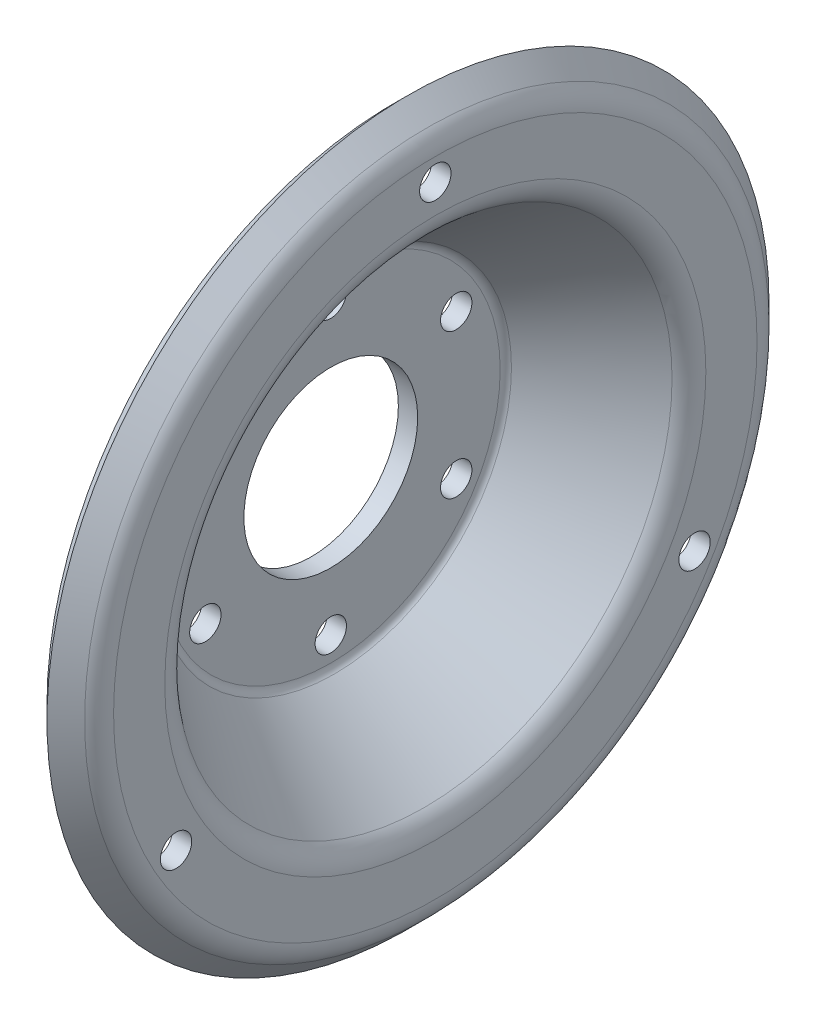
ISO-10303-21;
HEADER;
FILE_DESCRIPTION(('STEP AP214'),'2;1');
FILE_NAME('part.step','',(''),(''),'','','');
FILE_SCHEMA(('AUTOMOTIVE_DESIGN { 1 0 10303 214 1 1 1 1 }'));
ENDSEC;
DATA;
#1=APPLICATION_CONTEXT('core data for automotive mechanical design processes');
#2=APPLICATION_PROTOCOL_DEFINITION('international standard','automotive_design',2000,#1);
#3=PRODUCT_CONTEXT('',#1,'mechanical');
#4=PRODUCT('Part','Part','',(#3));
#5=PRODUCT_RELATED_PRODUCT_CATEGORY('part','',(#4));
#6=PRODUCT_DEFINITION_FORMATION('','',#4);
#7=PRODUCT_DEFINITION_CONTEXT('part definition',#1,'design');
#8=PRODUCT_DEFINITION('design','',#6,#7);
#9=PRODUCT_DEFINITION_SHAPE('','',#8);
#10=(LENGTH_UNIT() NAMED_UNIT(*) SI_UNIT(.MILLI.,.METRE.));
#11=(NAMED_UNIT(*) PLANE_ANGLE_UNIT() SI_UNIT($,.RADIAN.));
#12=(NAMED_UNIT(*) SI_UNIT($,.STERADIAN.) SOLID_ANGLE_UNIT());
#13=UNCERTAINTY_MEASURE_WITH_UNIT(LENGTH_MEASURE(1.E-05),#10,'distance_accuracy_value','');
#14=(GEOMETRIC_REPRESENTATION_CONTEXT(3) GLOBAL_UNCERTAINTY_ASSIGNED_CONTEXT((#13)) GLOBAL_UNIT_ASSIGNED_CONTEXT((#10,
#11,#12)) REPRESENTATION_CONTEXT('',''));
#15=CARTESIAN_POINT('',(0.,0.,0.));
#16=DIRECTION('',(0.,0.,1.));
#17=DIRECTION('',(1.,0.,0.));
#18=AXIS2_PLACEMENT_3D('',#15,#16,#17);
#19=CARTESIAN_POINT('',(3.175,28.6221475578846,0.));
#20=DIRECTION('',(1.,0.,0.));
#21=DIRECTION('',(0.,0.,-1.));
#22=AXIS2_PLACEMENT_3D('',#19,#20,#21);
#23=PLANE('',#22);
#24=CARTESIAN_POINT('',(3.175,0.,0.));
#25=DIRECTION('',(-1.,0.,0.));
#26=DIRECTION('',(0.,0.,1.));
#27=AXIS2_PLACEMENT_3D('',#24,#25,#26);
#28=CIRCLE('',#27,27.8519713368268);
#29=CARTESIAN_POINT('',(3.175,0.,-27.8519713368268));
#30=VERTEX_POINT('',#29);
#31=CARTESIAN_POINT('',(3.175,0.,27.8519713368267));
#32=VERTEX_POINT('',#31);
#33=EDGE_CURVE('E69',#30,#32,#28,.F.);
#34=ORIENTED_EDGE('',*,*,#33,.T.);
#35=CARTESIAN_POINT('',(3.175,0.,0.));
#36=DIRECTION('',(-1.,0.,0.));
#37=DIRECTION('',(0.,0.,-1.));
#38=AXIS2_PLACEMENT_3D('',#35,#36,#37);
#39=CIRCLE('',#38,27.8519713368267);
#40=EDGE_CURVE('E66',#32,#30,#39,.F.);
#41=ORIENTED_EDGE('',*,*,#40,.T.);
#42=EDGE_LOOP('',(#34,#41));
#43=FACE_BOUND('',#42,.T.);
#44=CARTESIAN_POINT('',(3.175,23.8125,0.));
#45=DIRECTION('',(1.,0.,0.));
#46=DIRECTION('',(0.,0.,-1.));
#47=AXIS2_PLACEMENT_3D('',#44,#45,#46);
#48=CIRCLE('',#47,2.5781);
#49=CARTESIAN_POINT('',(3.175,23.8125,-2.57809999999996));
#50=VERTEX_POINT('',#49);
#51=EDGE_CURVE('E353',#50,#50,#48,.F.);
#52=ORIENTED_EDGE('',*,*,#51,.T.);
#53=EDGE_LOOP('',(#52));
#54=FACE_BOUND('',#53,.T.);
#55=CARTESIAN_POINT('',(3.175,0.,0.));
#56=DIRECTION('',(1.,0.,0.));
#57=DIRECTION('',(0.,0.,-1.));
#58=AXIS2_PLACEMENT_3D('',#55,#56,#57);
#59=CIRCLE('',#58,14.2875);
#60=CARTESIAN_POINT('',(3.175,0.,-14.2875));
#61=VERTEX_POINT('',#60);
#62=EDGE_CURVE('E356',#61,#61,#59,.F.);
#63=ORIENTED_EDGE('',*,*,#62,.T.);
#64=EDGE_LOOP('',(#63));
#65=FACE_BOUND('',#64,.T.);
#66=CARTESIAN_POINT('',(3.175,11.90625,-20.622229927617));
#67=DIRECTION('',(1.,0.,0.));
#68=DIRECTION('',(0.,0.,-1.));
#69=AXIS2_PLACEMENT_3D('',#66,#67,#68);
#70=CIRCLE('',#69,2.5781);
#71=CARTESIAN_POINT('',(3.175,11.90625,-23.200329927617));
#72=VERTEX_POINT('',#71);
#73=EDGE_CURVE('E359',#72,#72,#70,.F.);
#74=ORIENTED_EDGE('',*,*,#73,.T.);
#75=EDGE_LOOP('',(#74));
#76=FACE_BOUND('',#75,.T.);
#77=CARTESIAN_POINT('',(3.175,-11.9062500000001,-20.6222299276169));
#78=DIRECTION('',(1.,0.,0.));
#79=DIRECTION('',(0.,0.,-1.));
#80=AXIS2_PLACEMENT_3D('',#77,#78,#79);
#81=CIRCLE('',#80,2.5781);
#82=CARTESIAN_POINT('',(3.175,-11.9062500000001,-23.2003299276169));
#83=VERTEX_POINT('',#82);
#84=EDGE_CURVE('E362',#83,#83,#81,.F.);
#85=ORIENTED_EDGE('',*,*,#84,.T.);
#86=EDGE_LOOP('',(#85));
#87=FACE_BOUND('',#86,.T.);
#88=CARTESIAN_POINT('',(3.175,-23.8125,0.));
#89=DIRECTION('',(1.,0.,0.));
#90=DIRECTION('',(0.,0.,-1.));
#91=AXIS2_PLACEMENT_3D('',#88,#89,#90);
#92=CIRCLE('',#91,2.5781);
#93=CARTESIAN_POINT('',(3.175,-23.8125,-2.57810000000004));
#94=VERTEX_POINT('',#93);
#95=EDGE_CURVE('E365',#94,#94,#92,.F.);
#96=ORIENTED_EDGE('',*,*,#95,.T.);
#97=EDGE_LOOP('',(#96));
#98=FACE_BOUND('',#97,.T.);
#99=CARTESIAN_POINT('',(3.175,-11.9062499999998,20.622229927617));
#100=DIRECTION('',(1.,0.,0.));
#101=DIRECTION('',(0.,0.,-1.));
#102=AXIS2_PLACEMENT_3D('',#99,#100,#101);
#103=CIRCLE('',#102,2.5781);
#104=CARTESIAN_POINT('',(3.175,-11.9062499999998,18.044129927617));
#105=VERTEX_POINT('',#104);
#106=EDGE_CURVE('E368',#105,#105,#103,.F.);
#107=ORIENTED_EDGE('',*,*,#106,.T.);
#108=EDGE_LOOP('',(#107));
#109=FACE_BOUND('',#108,.T.);
#110=CARTESIAN_POINT('',(3.175,11.9062500000003,20.6222299276169));
#111=DIRECTION('',(1.,0.,0.));
#112=DIRECTION('',(0.,0.,-1.));
#113=AXIS2_PLACEMENT_3D('',#110,#111,#112);
#114=CIRCLE('',#113,2.5781);
#115=CARTESIAN_POINT('',(3.175,11.9062500000003,18.0441299276169));
#116=VERTEX_POINT('',#115);
#117=EDGE_CURVE('E74',#116,#116,#114,.F.);
#118=ORIENTED_EDGE('',*,*,#117,.T.);
#119=EDGE_LOOP('',(#118));
#120=FACE_BOUND('',#119,.T.);
#121=ADVANCED_FACE('F17',(#43,#54,#65,#76,#87,#98,#109,#120),#23,.T.);
#122=CARTESIAN_POINT('',(4.7625,0.,0.));
#123=DIRECTION('',(1.,0.,0.));
#124=DIRECTION('',(0.,0.,-1.));
#125=AXIS2_PLACEMENT_3D('',#122,#123,#124);
#126=TOROIDAL_SURFACE('',#125,27.8519713368267,1.5875);
#127=ORIENTED_EDGE('',*,*,#33,.F.);
#128=ORIENTED_EDGE('',*,*,#40,.F.);
#129=EDGE_LOOP('',(#127,#128));
#130=FACE_BOUND('',#129,.T.);
#131=CARTESIAN_POINT('',(3.77992162606518,0.,0.));
#132=DIRECTION('',(1.,0.,0.));
#133=DIRECTION('',(0.,0.,-1.));
#134=AXIS2_PLACEMENT_3D('',#131,#132,#133);
#135=CIRCLE('',#134,29.0988458249272);
#136=CARTESIAN_POINT('',(3.77992162606518,0.,-29.0988458249272));
#137=VERTEX_POINT('',#136);
#138=EDGE_CURVE('E352',#137,#137,#135,.T.);
#139=ORIENTED_EDGE('',*,*,#138,.T.);
#140=EDGE_LOOP('',(#139));
#141=FACE_BOUND('',#140,.T.);
#142=ADVANCED_FACE('F77',(#130,#141),#126,.F.);
#143=CARTESIAN_POINT('',(20.35937,11.9062500000003,20.6222299276169));
#144=DIRECTION('',(1.,0.,0.));
#145=DIRECTION('',(0.,0.,-1.));
#146=AXIS2_PLACEMENT_3D('',#143,#144,#145);
#147=CYLINDRICAL_SURFACE('',#146,2.5781);
#148=CARTESIAN_POINT('',(0.,11.9062500000003,20.6222299276169));
#149=DIRECTION('',(1.,0.,0.));
#150=DIRECTION('',(0.,0.,-1.));
#151=AXIS2_PLACEMENT_3D('',#148,#149,#150);
#152=CIRCLE('',#151,2.5781);
#153=CARTESIAN_POINT('',(0.,11.9062500000003,18.0441299276169));
#154=VERTEX_POINT('',#153);
#155=EDGE_CURVE('E349',#154,#154,#152,.T.);
#156=ORIENTED_EDGE('',*,*,#155,.F.);
#157=EDGE_LOOP('',(#156));
#158=FACE_BOUND('',#157,.T.);
#159=ORIENTED_EDGE('',*,*,#117,.F.);
#160=EDGE_LOOP('',(#159));
#161=FACE_BOUND('',#160,.T.);
#162=ADVANCED_FACE('F422',(#158,#161),#147,.F.);
#163=CARTESIAN_POINT('',(20.35937,-11.9062499999998,20.622229927617));
#164=DIRECTION('',(1.,0.,0.));
#165=DIRECTION('',(0.,0.,-1.));
#166=AXIS2_PLACEMENT_3D('',#163,#164,#165);
#167=CYLINDRICAL_SURFACE('',#166,2.5781);
#168=CARTESIAN_POINT('',(0.,-11.9062499999998,20.622229927617));
#169=DIRECTION('',(1.,0.,0.));
#170=DIRECTION('',(0.,0.,-1.));
#171=AXIS2_PLACEMENT_3D('',#168,#169,#170);
#172=CIRCLE('',#171,2.5781);
#173=CARTESIAN_POINT('',(0.,-11.9062499999998,18.044129927617));
#174=VERTEX_POINT('',#173);
#175=EDGE_CURVE('E346',#174,#174,#172,.T.);
#176=ORIENTED_EDGE('',*,*,#175,.F.);
#177=EDGE_LOOP('',(#176));
#178=FACE_BOUND('',#177,.T.);
#179=ORIENTED_EDGE('',*,*,#106,.F.);
#180=EDGE_LOOP('',(#179));
#181=FACE_BOUND('',#180,.T.);
#182=ADVANCED_FACE('F426',(#178,#181),#167,.F.);
#183=CARTESIAN_POINT('',(20.35937,-23.8125,0.));
#184=DIRECTION('',(1.,0.,0.));
#185=DIRECTION('',(0.,0.,-1.));
#186=AXIS2_PLACEMENT_3D('',#183,#184,#185);
#187=CYLINDRICAL_SURFACE('',#186,2.5781);
#188=CARTESIAN_POINT('',(0.,-23.8125,0.));
#189=DIRECTION('',(1.,0.,0.));
#190=DIRECTION('',(0.,0.,-1.));
#191=AXIS2_PLACEMENT_3D('',#188,#189,#190);
#192=CIRCLE('',#191,2.5781);
#193=CARTESIAN_POINT('',(0.,-23.8125,-2.57810000000004));
#194=VERTEX_POINT('',#193);
#195=EDGE_CURVE('E343',#194,#194,#192,.T.);
#196=ORIENTED_EDGE('',*,*,#195,.F.);
#197=EDGE_LOOP('',(#196));
#198=FACE_BOUND('',#197,.T.);
#199=ORIENTED_EDGE('',*,*,#95,.F.);
#200=EDGE_LOOP('',(#199));
#201=FACE_BOUND('',#200,.T.);
#202=ADVANCED_FACE('F430',(#198,#201),#187,.F.);
#203=CARTESIAN_POINT('',(20.35937,-11.9062500000001,-20.6222299276169));
#204=DIRECTION('',(1.,0.,0.));
#205=DIRECTION('',(0.,0.,-1.));
#206=AXIS2_PLACEMENT_3D('',#203,#204,#205);
#207=CYLINDRICAL_SURFACE('',#206,2.5781);
#208=CARTESIAN_POINT('',(0.,-11.9062500000001,-20.6222299276169));
#209=DIRECTION('',(1.,0.,0.));
#210=DIRECTION('',(0.,0.,-1.));
#211=AXIS2_PLACEMENT_3D('',#208,#209,#210);
#212=CIRCLE('',#211,2.5781);
#213=CARTESIAN_POINT('',(0.,-11.9062500000001,-23.2003299276169));
#214=VERTEX_POINT('',#213);
#215=EDGE_CURVE('E340',#214,#214,#212,.T.);
#216=ORIENTED_EDGE('',*,*,#215,.F.);
#217=EDGE_LOOP('',(#216));
#218=FACE_BOUND('',#217,.T.);
#219=ORIENTED_EDGE('',*,*,#84,.F.);
#220=EDGE_LOOP('',(#219));
#221=FACE_BOUND('',#220,.T.);
#222=ADVANCED_FACE('F434',(#218,#221),#207,.F.);
#223=CARTESIAN_POINT('',(20.35937,11.90625,-20.622229927617));
#224=DIRECTION('',(1.,0.,0.));
#225=DIRECTION('',(0.,0.,-1.));
#226=AXIS2_PLACEMENT_3D('',#223,#224,#225);
#227=CYLINDRICAL_SURFACE('',#226,2.5781);
#228=CARTESIAN_POINT('',(0.,11.90625,-20.622229927617));
#229=DIRECTION('',(1.,0.,0.));
#230=DIRECTION('',(0.,0.,-1.));
#231=AXIS2_PLACEMENT_3D('',#228,#229,#230);
#232=CIRCLE('',#231,2.5781);
#233=CARTESIAN_POINT('',(0.,11.90625,-23.200329927617));
#234=VERTEX_POINT('',#233);
#235=EDGE_CURVE('E337',#234,#234,#232,.T.);
#236=ORIENTED_EDGE('',*,*,#235,.F.);
#237=EDGE_LOOP('',(#236));
#238=FACE_BOUND('',#237,.T.);
#239=ORIENTED_EDGE('',*,*,#73,.F.);
#240=EDGE_LOOP('',(#239));
#241=FACE_BOUND('',#240,.T.);
#242=ADVANCED_FACE('F438',(#238,#241),#227,.F.);
#243=CARTESIAN_POINT('',(20.35937,0.,0.));
#244=DIRECTION('',(1.,0.,0.));
#245=DIRECTION('',(0.,0.,-1.));
#246=AXIS2_PLACEMENT_3D('',#243,#244,#245);
#247=CYLINDRICAL_SURFACE('',#246,14.2875);
#248=CARTESIAN_POINT('',(0.,0.,0.));
#249=DIRECTION('',(1.,0.,0.));
#250=DIRECTION('',(0.,0.,-1.));
#251=AXIS2_PLACEMENT_3D('',#248,#249,#250);
#252=CIRCLE('',#251,14.2875);
#253=CARTESIAN_POINT('',(0.,0.,-14.2875));
#254=VERTEX_POINT('',#253);
#255=EDGE_CURVE('E334',#254,#254,#252,.T.);
#256=ORIENTED_EDGE('',*,*,#255,.F.);
#257=EDGE_LOOP('',(#256));
#258=FACE_BOUND('',#257,.T.);
#259=ORIENTED_EDGE('',*,*,#62,.F.);
#260=EDGE_LOOP('',(#259));
#261=FACE_BOUND('',#260,.T.);
#262=ADVANCED_FACE('F442',(#258,#261),#247,.F.);
#263=CARTESIAN_POINT('',(20.35937,23.8125,0.));
#264=DIRECTION('',(1.,0.,0.));
#265=DIRECTION('',(0.,0.,-1.));
#266=AXIS2_PLACEMENT_3D('',#263,#264,#265);
#267=CYLINDRICAL_SURFACE('',#266,2.5781);
#268=CARTESIAN_POINT('',(0.,23.8125,0.));
#269=DIRECTION('',(1.,0.,0.));
#270=DIRECTION('',(0.,0.,-1.));
#271=AXIS2_PLACEMENT_3D('',#268,#269,#270);
#272=CIRCLE('',#271,2.5781);
#273=CARTESIAN_POINT('',(0.,23.8125,-2.57809999999996));
#274=VERTEX_POINT('',#273);
#275=EDGE_CURVE('E330',#274,#274,#272,.T.);
#276=ORIENTED_EDGE('',*,*,#275,.F.);
#277=EDGE_LOOP('',(#276));
#278=FACE_BOUND('',#277,.T.);
#279=ORIENTED_EDGE('',*,*,#51,.F.);
#280=EDGE_LOOP('',(#279));
#281=FACE_BOUND('',#280,.T.);
#282=ADVANCED_FACE('F446',(#278,#281),#267,.F.);
#283=CARTESIAN_POINT('',(18.5446051218044,0.,0.));
#284=DIRECTION('',(1.,0.,0.));
#285=DIRECTION('',(0.,0.,-1.));
#286=AXIS2_PLACEMENT_3D('',#283,#284,#285);
#287=CONICAL_SURFACE('',#286,40.7339051988722,0.667401340831002);
#288=ORIENTED_EDGE('',*,*,#138,.F.);
#289=EDGE_LOOP('',(#288));
#290=FACE_BOUND('',#289,.T.);
#291=CARTESIAN_POINT('',(18.5446051218045,0.,0.));
#292=DIRECTION('',(1.,0.,0.));
#293=DIRECTION('',(0.,0.,-1.));
#294=AXIS2_PLACEMENT_3D('',#291,#292,#293);
#295=CIRCLE('',#294,40.7339051988721);
#296=CARTESIAN_POINT('',(18.5446051218045,0.,-40.7339051988721));
#297=VERTEX_POINT('',#296);
#298=EDGE_CURVE('E333',#297,#297,#295,.F.);
#299=ORIENTED_EDGE('',*,*,#298,.F.);
#300=EDGE_LOOP('',(#299));
#301=FACE_BOUND('',#300,.T.);
#302=ADVANCED_FACE('F450',(#290,#301),#287,.F.);
#303=CARTESIAN_POINT('',(15.8692419394653,0.,0.));
#304=DIRECTION('',(-1.,0.,0.));
#305=DIRECTION('',(0.,0.,1.));
#306=AXIS2_PLACEMENT_3D('',#303,#304,#305);
#307=CONICAL_SURFACE('',#306,59.3541280605346,0.785398163397446);
#308=CARTESIAN_POINT('',(18.9644660454009,0.,0.));
#309=DIRECTION('',(1.,0.,0.));
#310=DIRECTION('',(0.,0.,-1.));
#311=AXIS2_PLACEMENT_3D('',#308,#309,#310);
#312=CIRCLE('',#311,56.258903954599);
#313=CARTESIAN_POINT('',(18.9644660454009,0.,-56.258903954599));
#314=VERTEX_POINT('',#313);
#315=EDGE_CURVE('E408',#314,#314,#312,.T.);
#316=ORIENTED_EDGE('',*,*,#315,.F.);
#317=EDGE_LOOP('',(#316));
#318=FACE_BOUND('',#317,.T.);
#319=CARTESIAN_POINT('',(15.8692419394654,0.,0.));
#320=DIRECTION('',(1.,0.,0.));
#321=DIRECTION('',(0.,0.,-1.));
#322=AXIS2_PLACEMENT_3D('',#319,#320,#321);
#323=CIRCLE('',#322,59.3541280605347);
#324=CARTESIAN_POINT('',(15.8692419394654,0.,-59.3541280605347));
#325=VERTEX_POINT('',#324);
#326=EDGE_CURVE('E153',#325,#325,#323,.F.);
#327=ORIENTED_EDGE('',*,*,#326,.F.);
#328=EDGE_LOOP('',(#327));
#329=FACE_BOUND('',#328,.T.);
#330=ADVANCED_FACE('F453',(#318,#329),#307,.T.);
#331=CARTESIAN_POINT('',(0.,0.,0.));
#332=DIRECTION('',(-1.,0.,0.));
#333=DIRECTION('',(0.,0.,1.));
#334=AXIS2_PLACEMENT_3D('',#331,#332,#333);
#335=PLANE('',#334);
#336=CARTESIAN_POINT('',(0.,0.,0.));
#337=DIRECTION('',(1.,0.,0.));
#338=DIRECTION('',(0.,0.,-1.));
#339=AXIS2_PLACEMENT_3D('',#336,#337,#338);
#340=CIRCLE('',#339,27.8519713368267);
#341=CARTESIAN_POINT('',(0.,0.,-27.8519713368267));
#342=VERTEX_POINT('',#341);
#343=CARTESIAN_POINT('',(0.,0.,27.8519713368268));
#344=VERTEX_POINT('',#343);
#345=EDGE_CURVE('E128',#342,#344,#340,.T.);
#346=ORIENTED_EDGE('',*,*,#345,.F.);
#347=CARTESIAN_POINT('',(0.,0.,0.));
#348=DIRECTION('',(1.,0.,0.));
#349=DIRECTION('',(0.,0.,1.));
#350=AXIS2_PLACEMENT_3D('',#347,#348,#349);
#351=CIRCLE('',#350,27.8519713368268);
#352=EDGE_CURVE('E138',#344,#342,#351,.T.);
#353=ORIENTED_EDGE('',*,*,#352,.F.);
#354=EDGE_LOOP('',(#346,#353));
#355=FACE_BOUND('',#354,.T.);
#356=ORIENTED_EDGE('',*,*,#275,.T.);
#357=EDGE_LOOP('',(#356));
#358=FACE_BOUND('',#357,.T.);
#359=ORIENTED_EDGE('',*,*,#255,.T.);
#360=EDGE_LOOP('',(#359));
#361=FACE_BOUND('',#360,.T.);
#362=ORIENTED_EDGE('',*,*,#235,.T.);
#363=EDGE_LOOP('',(#362));
#364=FACE_BOUND('',#363,.T.);
#365=ORIENTED_EDGE('',*,*,#215,.T.);
#366=EDGE_LOOP('',(#365));
#367=FACE_BOUND('',#366,.T.);
#368=ORIENTED_EDGE('',*,*,#195,.T.);
#369=EDGE_LOOP('',(#368));
#370=FACE_BOUND('',#369,.T.);
#371=ORIENTED_EDGE('',*,*,#175,.T.);
#372=EDGE_LOOP('',(#371));
#373=FACE_BOUND('',#372,.T.);
#374=ORIENTED_EDGE('',*,*,#155,.T.);
#375=EDGE_LOOP('',(#374));
#376=FACE_BOUND('',#375,.T.);
#377=ADVANCED_FACE('F97',(#355,#358,#361,#364,#367,#370,#373,#376),#335,.T.);
#378=CARTESIAN_POINT('',(15.59687,0.,0.));
#379=DIRECTION('',(1.,0.,0.));
#380=DIRECTION('',(0.,0.,-1.));
#381=AXIS2_PLACEMENT_3D('',#378,#379,#380);
#382=TOROIDAL_SURFACE('',#381,44.4745286631733,4.7625);
#383=ORIENTED_EDGE('',*,*,#298,.T.);
#384=EDGE_LOOP('',(#383));
#385=FACE_BOUND('',#384,.T.);
#386=CARTESIAN_POINT('',(20.35937,0.,0.));
#387=DIRECTION('',(1.,0.,0.));
#388=DIRECTION('',(0.,0.,-1.));
#389=AXIS2_PLACEMENT_3D('',#386,#387,#388);
#390=CIRCLE('',#389,44.4745286631734);
#391=CARTESIAN_POINT('',(20.35937,0.,44.4745286631734));
#392=VERTEX_POINT('',#391);
#393=CARTESIAN_POINT('',(20.35937,0.,-44.4745286631734));
#394=VERTEX_POINT('',#393);
#395=EDGE_CURVE('E114',#392,#394,#390,.F.);
#396=ORIENTED_EDGE('',*,*,#395,.F.);
#397=CARTESIAN_POINT('',(20.35937,0.,0.));
#398=DIRECTION('',(1.,0.,0.));
#399=DIRECTION('',(0.,0.,1.));
#400=AXIS2_PLACEMENT_3D('',#397,#398,#399);
#401=CIRCLE('',#400,44.4745286631734);
#402=EDGE_CURVE('E222',#394,#392,#401,.F.);
#403=ORIENTED_EDGE('',*,*,#402,.F.);
#404=EDGE_LOOP('',(#396,#403));
#405=FACE_BOUND('',#404,.T.);
#406=ADVANCED_FACE('F85',(#385,#405),#382,.T.);
#407=CARTESIAN_POINT('',(15.59687,0.,0.));
#408=DIRECTION('',(1.,0.,0.));
#409=DIRECTION('',(0.,0.,-1.));
#410=AXIS2_PLACEMENT_3D('',#407,#408,#409);
#411=TOROIDAL_SURFACE('',#410,52.8913079091981,4.7625);
#412=ORIENTED_EDGE('',*,*,#315,.T.);
#413=EDGE_LOOP('',(#412));
#414=FACE_BOUND('',#413,.T.);
#415=CARTESIAN_POINT('',(20.35937,0.,0.));
#416=DIRECTION('',(-1.,0.,0.));
#417=DIRECTION('',(0.,0.,-1.));
#418=AXIS2_PLACEMENT_3D('',#415,#416,#417);
#419=CIRCLE('',#418,52.8913079091981);
#420=CARTESIAN_POINT('',(20.35937,0.,52.8913079091981));
#421=VERTEX_POINT('',#420);
#422=CARTESIAN_POINT('',(20.35937,0.,-52.8913079091982));
#423=VERTEX_POINT('',#422);
#424=EDGE_CURVE('E177',#421,#423,#419,.F.);
#425=ORIENTED_EDGE('',*,*,#424,.F.);
#426=CARTESIAN_POINT('',(20.35937,0.,0.));
#427=DIRECTION('',(-1.,0.,0.));
#428=DIRECTION('',(0.,0.,1.));
#429=AXIS2_PLACEMENT_3D('',#426,#427,#428);
#430=CIRCLE('',#429,52.8913079091981);
#431=EDGE_CURVE('E182',#423,#421,#430,.F.);
#432=ORIENTED_EDGE('',*,*,#431,.F.);
#433=EDGE_LOOP('',(#425,#432));
#434=FACE_BOUND('',#433,.T.);
#435=ADVANCED_FACE('F96',(#414,#434),#411,.T.);
#436=CARTESIAN_POINT('',(15.8692419394654,0.,0.));
#437=DIRECTION('',(1.,0.,0.));
#438=DIRECTION('',(0.,0.,-1.));
#439=AXIS2_PLACEMENT_3D('',#436,#437,#438);
#440=CONICAL_SURFACE('',#439,59.3541280605347,0.785398163397451);
#441=CARTESIAN_POINT('',(13.6241779091981,0.,0.));
#442=DIRECTION('',(-1.,0.,0.));
#443=DIRECTION('',(0.,0.,1.));
#444=AXIS2_PLACEMENT_3D('',#441,#442,#443);
#445=CIRCLE('',#444,57.1090640302674);
#446=CARTESIAN_POINT('',(13.6241779091981,0.,57.1090640302674));
#447=VERTEX_POINT('',#446);
#448=EDGE_CURVE('E175',#447,#447,#445,.F.);
#449=ORIENTED_EDGE('',*,*,#448,.T.);
#450=EDGE_LOOP('',(#449));
#451=FACE_BOUND('',#450,.T.);
#452=ORIENTED_EDGE('',*,*,#326,.T.);
#453=EDGE_LOOP('',(#452));
#454=FACE_BOUND('',#453,.T.);
#455=ADVANCED_FACE('F166',(#451,#454),#440,.T.);
#456=CARTESIAN_POINT('',(4.7625,0.,0.));
#457=DIRECTION('',(-1.,0.,0.));
#458=DIRECTION('',(0.,0.,1.));
#459=AXIS2_PLACEMENT_3D('',#456,#457,#458);
#460=TOROIDAL_SURFACE('',#459,27.8519713368267,4.7625);
#461=ORIENTED_EDGE('',*,*,#352,.T.);
#462=ORIENTED_EDGE('',*,*,#345,.T.);
#463=EDGE_LOOP('',(#461,#462));
#464=FACE_BOUND('',#463,.T.);
#465=CARTESIAN_POINT('',(1.81476487819557,0.,0.));
#466=DIRECTION('',(1.,0.,0.));
#467=DIRECTION('',(0.,0.,-1.));
#468=AXIS2_PLACEMENT_3D('',#465,#466,#467);
#469=CIRCLE('',#468,31.5925948011279);
#470=CARTESIAN_POINT('',(1.81476487819557,0.,-31.5925948011279));
#471=VERTEX_POINT('',#470);
#472=EDGE_CURVE('E173',#471,#471,#469,.T.);
#473=ORIENTED_EDGE('',*,*,#472,.F.);
#474=EDGE_LOOP('',(#473));
#475=FACE_BOUND('',#474,.T.);
#476=ADVANCED_FACE('F155',(#464,#475),#460,.T.);
#477=CARTESIAN_POINT('',(20.35937,54.864,0.));
#478=DIRECTION('',(1.,0.,0.));
#479=DIRECTION('',(0.,0.,-1.));
#480=AXIS2_PLACEMENT_3D('',#477,#478,#479);
#481=PLANE('',#480);
#482=ORIENTED_EDGE('',*,*,#431,.T.);
#483=ORIENTED_EDGE('',*,*,#424,.T.);
#484=EDGE_LOOP('',(#482,#483));
#485=FACE_BOUND('',#484,.T.);
#486=ORIENTED_EDGE('',*,*,#402,.T.);
#487=ORIENTED_EDGE('',*,*,#395,.T.);
#488=EDGE_LOOP('',(#486,#487));
#489=FACE_BOUND('',#488,.T.);
#490=CARTESIAN_POINT('',(20.35937,49.2125,0.));
#491=DIRECTION('',(-1.,0.,0.));
#492=DIRECTION('',(0.,0.,1.));
#493=AXIS2_PLACEMENT_3D('',#490,#491,#492);
#494=CIRCLE('',#493,2.5781);
#495=CARTESIAN_POINT('',(20.35937,49.2125,2.57810000000005));
#496=VERTEX_POINT('',#495);
#497=EDGE_CURVE('E227',#496,#496,#494,.T.);
#498=ORIENTED_EDGE('',*,*,#497,.T.);
#499=EDGE_LOOP('',(#498));
#500=FACE_BOUND('',#499,.T.);
#501=CARTESIAN_POINT('',(20.35937,-24.60625,42.6192751837416));
#502=DIRECTION('',(-1.,0.,0.));
#503=DIRECTION('',(0.,0.,1.));
#504=AXIS2_PLACEMENT_3D('',#501,#502,#503);
#505=CIRCLE('',#504,2.5781);
#506=CARTESIAN_POINT('',(20.35937,-24.60625,45.1973751837416));
#507=VERTEX_POINT('',#506);
#508=EDGE_CURVE('E324',#507,#507,#505,.T.);
#509=ORIENTED_EDGE('',*,*,#508,.T.);
#510=EDGE_LOOP('',(#509));
#511=FACE_BOUND('',#510,.T.);
#512=CARTESIAN_POINT('',(20.35937,-24.6062499999997,-42.619275183742));
#513=DIRECTION('',(-1.,0.,0.));
#514=DIRECTION('',(0.,0.,1.));
#515=AXIS2_PLACEMENT_3D('',#512,#513,#514);
#516=CIRCLE('',#515,2.5781);
#517=CARTESIAN_POINT('',(20.35937,-24.6062499999997,-40.041175183742));
#518=VERTEX_POINT('',#517);
#519=EDGE_CURVE('E327',#518,#518,#516,.T.);
#520=ORIENTED_EDGE('',*,*,#519,.T.);
#521=EDGE_LOOP('',(#520));
#522=FACE_BOUND('',#521,.T.);
#523=ADVANCED_FACE('F165',(#485,#489,#500,#511,#522),#481,.T.);
#524=CARTESIAN_POINT('',(13.6241779091981,0.,0.));
#525=DIRECTION('',(-1.,0.,0.));
#526=DIRECTION('',(0.,0.,1.));
#527=AXIS2_PLACEMENT_3D('',#524,#525,#526);
#528=CONICAL_SURFACE('',#527,57.1090640302674,0.785398163397446);
#529=ORIENTED_EDGE('',*,*,#448,.F.);
#530=EDGE_LOOP('',(#529));
#531=FACE_BOUND('',#530,.T.);
#532=CARTESIAN_POINT('',(16.7194020151336,0.,0.));
#533=DIRECTION('',(-1.,0.,0.));
#534=DIRECTION('',(0.,0.,1.));
#535=AXIS2_PLACEMENT_3D('',#532,#533,#534);
#536=CIRCLE('',#535,54.0138399243318);
#537=CARTESIAN_POINT('',(16.7194020151336,0.,54.0138399243318));
#538=VERTEX_POINT('',#537);
#539=EDGE_CURVE('E223',#538,#538,#536,.F.);
#540=ORIENTED_EDGE('',*,*,#539,.T.);
#541=EDGE_LOOP('',(#540));
#542=FACE_BOUND('',#541,.T.);
#543=ADVANCED_FACE('F555',(#531,#542),#528,.F.);
#544=CARTESIAN_POINT('',(16.5794483739348,0.,0.));
#545=DIRECTION('',(1.,0.,0.));
#546=DIRECTION('',(0.,0.,-1.));
#547=AXIS2_PLACEMENT_3D('',#544,#545,#546);
#548=CONICAL_SURFACE('',#547,43.227654175073,0.667401340831002);
#549=CARTESIAN_POINT('',(16.5794483739349,0.,0.));
#550=DIRECTION('',(-1.,0.,0.));
#551=DIRECTION('',(0.,0.,1.));
#552=AXIS2_PLACEMENT_3D('',#549,#550,#551);
#553=CIRCLE('',#552,43.2276541750729);
#554=CARTESIAN_POINT('',(16.5794483739349,0.,43.2276541750729));
#555=VERTEX_POINT('',#554);
#556=EDGE_CURVE('E226',#555,#555,#553,.T.);
#557=ORIENTED_EDGE('',*,*,#556,.T.);
#558=EDGE_LOOP('',(#557));
#559=FACE_BOUND('',#558,.T.);
#560=ORIENTED_EDGE('',*,*,#472,.T.);
#561=EDGE_LOOP('',(#560));
#562=FACE_BOUND('',#561,.T.);
#563=ADVANCED_FACE('F561',(#559,#562),#548,.T.);
#564=CARTESIAN_POINT('',(0.,-24.6062499999997,-42.619275183742));
#565=DIRECTION('',(-1.,0.,0.));
#566=DIRECTION('',(0.,0.,1.));
#567=AXIS2_PLACEMENT_3D('',#564,#565,#566);
#568=CYLINDRICAL_SURFACE('',#567,2.5781);
#569=CARTESIAN_POINT('',(17.18437,-24.6062499999997,-42.619275183742));
#570=DIRECTION('',(-1.,0.,0.));
#571=DIRECTION('',(0.,0.,1.));
#572=AXIS2_PLACEMENT_3D('',#569,#570,#571);
#573=CIRCLE('',#572,2.5781);
#574=CARTESIAN_POINT('',(17.18437,-24.6062499999997,-40.041175183742));
#575=VERTEX_POINT('',#574);
#576=EDGE_CURVE('E230',#575,#575,#573,.F.);
#577=ORIENTED_EDGE('',*,*,#576,.F.);
#578=EDGE_LOOP('',(#577));
#579=FACE_BOUND('',#578,.T.);
#580=ORIENTED_EDGE('',*,*,#519,.F.);
#581=EDGE_LOOP('',(#580));
#582=FACE_BOUND('',#581,.T.);
#583=ADVANCED_FACE('F568',(#579,#582),#568,.F.);
#584=CARTESIAN_POINT('',(0.,-24.60625,42.6192751837416));
#585=DIRECTION('',(-1.,0.,0.));
#586=DIRECTION('',(0.,0.,1.));
#587=AXIS2_PLACEMENT_3D('',#584,#585,#586);
#588=CYLINDRICAL_SURFACE('',#587,2.5781);
#589=CARTESIAN_POINT('',(17.18437,-24.60625,42.6192751837416));
#590=DIRECTION('',(-1.,0.,0.));
#591=DIRECTION('',(0.,0.,1.));
#592=AXIS2_PLACEMENT_3D('',#589,#590,#591);
#593=CIRCLE('',#592,2.5781);
#594=CARTESIAN_POINT('',(17.18437,-24.60625,45.1973751837416));
#595=VERTEX_POINT('',#594);
#596=EDGE_CURVE('E310',#595,#595,#593,.F.);
#597=ORIENTED_EDGE('',*,*,#596,.F.);
#598=EDGE_LOOP('',(#597));
#599=FACE_BOUND('',#598,.T.);
#600=ORIENTED_EDGE('',*,*,#508,.F.);
#601=EDGE_LOOP('',(#600));
#602=FACE_BOUND('',#601,.T.);
#603=ADVANCED_FACE('F576',(#599,#602),#588,.F.);
#604=CARTESIAN_POINT('',(0.,49.2125,0.));
#605=DIRECTION('',(-1.,0.,0.));
#606=DIRECTION('',(0.,0.,1.));
#607=AXIS2_PLACEMENT_3D('',#604,#605,#606);
#608=CYLINDRICAL_SURFACE('',#607,2.5781);
#609=CARTESIAN_POINT('',(17.18437,49.2125,0.));
#610=DIRECTION('',(-1.,0.,0.));
#611=DIRECTION('',(0.,0.,1.));
#612=AXIS2_PLACEMENT_3D('',#609,#610,#611);
#613=CIRCLE('',#612,2.5781);
#614=CARTESIAN_POINT('',(17.18437,49.2125,2.57810000000005));
#615=VERTEX_POINT('',#614);
#616=EDGE_CURVE('E308',#615,#615,#613,.F.);
#617=ORIENTED_EDGE('',*,*,#616,.F.);
#618=EDGE_LOOP('',(#617));
#619=FACE_BOUND('',#618,.T.);
#620=ORIENTED_EDGE('',*,*,#497,.F.);
#621=EDGE_LOOP('',(#620));
#622=FACE_BOUND('',#621,.T.);
#623=ADVANCED_FACE('F247',(#619,#622),#608,.F.);
#624=CARTESIAN_POINT('',(15.59687,0.,0.));
#625=DIRECTION('',(-1.,0.,0.));
#626=DIRECTION('',(0.,0.,1.));
#627=AXIS2_PLACEMENT_3D('',#624,#625,#626);
#628=TOROIDAL_SURFACE('',#627,52.8913079091982,1.5875);
#629=ORIENTED_EDGE('',*,*,#539,.F.);
#630=EDGE_LOOP('',(#629));
#631=FACE_BOUND('',#630,.T.);
#632=CARTESIAN_POINT('',(17.18437,0.,0.));
#633=DIRECTION('',(1.,0.,0.));
#634=DIRECTION('',(0.,0.,1.));
#635=AXIS2_PLACEMENT_3D('',#632,#633,#634);
#636=CIRCLE('',#635,52.8913079091982);
#637=CARTESIAN_POINT('',(17.18437,0.,-52.8913079091982));
#638=VERTEX_POINT('',#637);
#639=CARTESIAN_POINT('',(17.18437,0.,52.8913079091982));
#640=VERTEX_POINT('',#639);
#641=EDGE_CURVE('E305',#638,#640,#636,.F.);
#642=ORIENTED_EDGE('',*,*,#641,.F.);
#643=CARTESIAN_POINT('',(17.18437,0.,0.));
#644=DIRECTION('',(1.,0.,0.));
#645=DIRECTION('',(0.,0.,-1.));
#646=AXIS2_PLACEMENT_3D('',#643,#644,#645);
#647=CIRCLE('',#646,52.8913079091982);
#648=EDGE_CURVE('E306',#640,#638,#647,.F.);
#649=ORIENTED_EDGE('',*,*,#648,.F.);
#650=EDGE_LOOP('',(#642,#649));
#651=FACE_BOUND('',#650,.T.);
#652=ADVANCED_FACE('F236',(#631,#651),#628,.F.);
#653=CARTESIAN_POINT('',(15.59687,0.,0.));
#654=DIRECTION('',(-1.,0.,0.));
#655=DIRECTION('',(0.,0.,1.));
#656=AXIS2_PLACEMENT_3D('',#653,#654,#655);
#657=TOROIDAL_SURFACE('',#656,44.4745286631733,1.5875);
#658=ORIENTED_EDGE('',*,*,#556,.F.);
#659=EDGE_LOOP('',(#658));
#660=FACE_BOUND('',#659,.T.);
#661=CARTESIAN_POINT('',(17.18437,0.,0.));
#662=DIRECTION('',(-1.,0.,0.));
#663=DIRECTION('',(0.,0.,-1.));
#664=AXIS2_PLACEMENT_3D('',#661,#662,#663);
#665=CIRCLE('',#664,44.4745286631734);
#666=CARTESIAN_POINT('',(17.18437,0.,44.4745286631734));
#667=VERTEX_POINT('',#666);
#668=CARTESIAN_POINT('',(17.18437,0.,-44.4745286631734));
#669=VERTEX_POINT('',#668);
#670=EDGE_CURVE('E28',#667,#669,#665,.F.);
#671=ORIENTED_EDGE('',*,*,#670,.F.);
#672=CARTESIAN_POINT('',(17.18437,0.,0.));
#673=DIRECTION('',(-1.,0.,0.));
#674=DIRECTION('',(0.,0.,1.));
#675=AXIS2_PLACEMENT_3D('',#672,#673,#674);
#676=CIRCLE('',#675,44.4745286631734);
#677=EDGE_CURVE('E11',#669,#667,#676,.F.);
#678=ORIENTED_EDGE('',*,*,#677,.F.);
#679=EDGE_LOOP('',(#671,#678));
#680=FACE_BOUND('',#679,.T.);
#681=ADVANCED_FACE('F246',(#660,#680),#657,.F.);
#682=CARTESIAN_POINT('',(17.18437,43.7043524421156,0.));
#683=DIRECTION('',(-1.,0.,0.));
#684=DIRECTION('',(0.,0.,1.));
#685=AXIS2_PLACEMENT_3D('',#682,#683,#684);
#686=PLANE('',#685);
#687=ORIENTED_EDGE('',*,*,#670,.T.);
#688=ORIENTED_EDGE('',*,*,#677,.T.);
#689=EDGE_LOOP('',(#687,#688));
#690=FACE_BOUND('',#689,.T.);
#691=ORIENTED_EDGE('',*,*,#648,.T.);
#692=ORIENTED_EDGE('',*,*,#641,.T.);
#693=EDGE_LOOP('',(#691,#692));
#694=FACE_BOUND('',#693,.T.);
#695=ORIENTED_EDGE('',*,*,#616,.T.);
#696=EDGE_LOOP('',(#695));
#697=FACE_BOUND('',#696,.T.);
#698=ORIENTED_EDGE('',*,*,#596,.T.);
#699=EDGE_LOOP('',(#698));
#700=FACE_BOUND('',#699,.T.);
#701=ORIENTED_EDGE('',*,*,#576,.T.);
#702=EDGE_LOOP('',(#701));
#703=FACE_BOUND('',#702,.T.);
#704=ADVANCED_FACE('F269',(#690,#694,#697,#700,#703),#686,.T.);
#705=CLOSED_SHELL('',(#121,#142,#162,#182,#202,#222,#242,#262,#282,#302,#330,#377,#406,#435,
#455,#476,#523,#543,#563,#583,#603,#623,#652,#681,#704));
#706=MANIFOLD_SOLID_BREP('B1',#705);
#707=ADVANCED_BREP_SHAPE_REPRESENTATION('',(#18,#706),#14);
#708=SHAPE_DEFINITION_REPRESENTATION(#9,#707);
ENDSEC;
END-ISO-10303-21;
